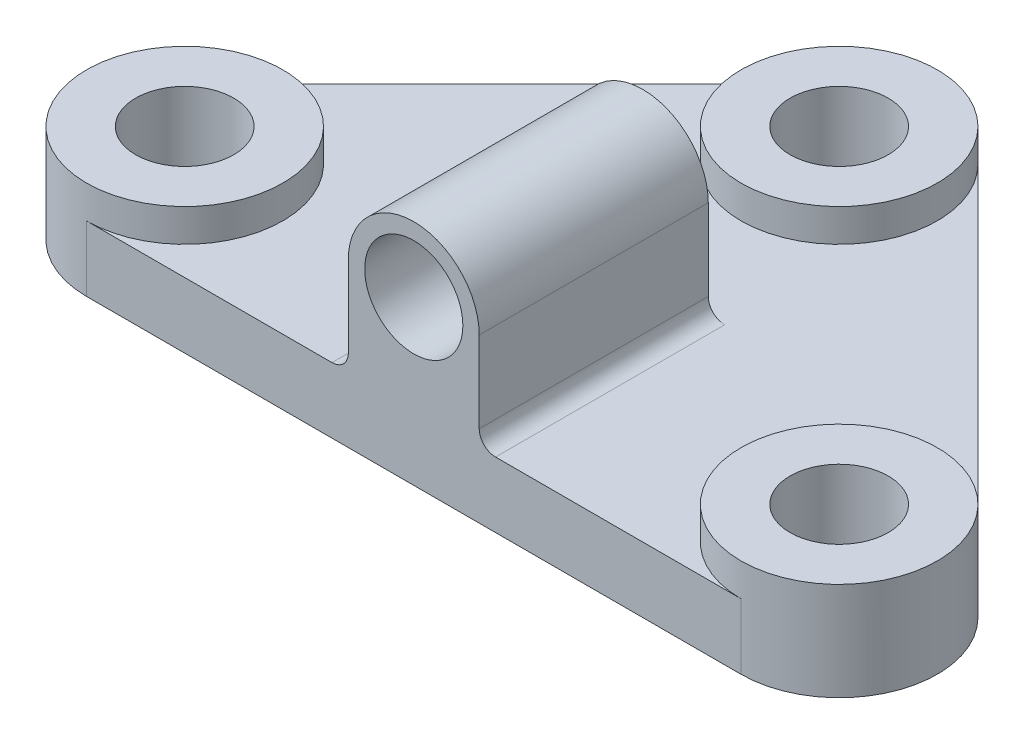
ISO-10303-21;
HEADER;
FILE_DESCRIPTION(('STEP AP214'),'2;1');
FILE_NAME('part.step','',(''),(''),'','','');
FILE_SCHEMA(('AUTOMOTIVE_DESIGN { 1 0 10303 214 1 1 1 1 }'));
ENDSEC;
DATA;
#1=APPLICATION_CONTEXT('core data for automotive mechanical design processes');
#2=APPLICATION_PROTOCOL_DEFINITION('international standard','automotive_design',2000,#1);
#3=PRODUCT_CONTEXT('',#1,'mechanical');
#4=PRODUCT('Part','Part','',(#3));
#5=PRODUCT_RELATED_PRODUCT_CATEGORY('part','',(#4));
#6=PRODUCT_DEFINITION_FORMATION('','',#4);
#7=PRODUCT_DEFINITION_CONTEXT('part definition',#1,'design');
#8=PRODUCT_DEFINITION('design','',#6,#7);
#9=PRODUCT_DEFINITION_SHAPE('','',#8);
#10=(LENGTH_UNIT() NAMED_UNIT(*) SI_UNIT(.MILLI.,.METRE.));
#11=(NAMED_UNIT(*) PLANE_ANGLE_UNIT() SI_UNIT($,.RADIAN.));
#12=(NAMED_UNIT(*) SI_UNIT($,.STERADIAN.) SOLID_ANGLE_UNIT());
#13=UNCERTAINTY_MEASURE_WITH_UNIT(LENGTH_MEASURE(1.E-05),#10,'distance_accuracy_value','');
#14=(GEOMETRIC_REPRESENTATION_CONTEXT(3) GLOBAL_UNCERTAINTY_ASSIGNED_CONTEXT((#13)) GLOBAL_UNIT_ASSIGNED_CONTEXT((#10,
#11,#12)) REPRESENTATION_CONTEXT('',''));
#15=CARTESIAN_POINT('',(0.,0.,0.));
#16=DIRECTION('',(0.,0.,1.));
#17=DIRECTION('',(1.,0.,0.));
#18=AXIS2_PLACEMENT_3D('',#15,#16,#17);
#19=CARTESIAN_POINT('',(100.,49.8,-40.));
#20=DIRECTION('',(0.,0.,-1.));
#21=DIRECTION('',(-1.,0.,0.));
#22=AXIS2_PLACEMENT_3D('',#19,#20,#21);
#23=CYLINDRICAL_SURFACE('',#22,20.);
#24=DIRECTION('',(0.,0.,1.));
#25=VECTOR('',#24,1.);
#26=CARTESIAN_POINT('',(120.,49.8,-40.));
#27=LINE('',#26,#25);
#28=CARTESIAN_POINT('',(120.,49.8,-40.));
#29=VERTEX_POINT('',#28);
#30=CARTESIAN_POINT('',(120.,49.8,30.));
#31=VERTEX_POINT('',#30);
#32=EDGE_CURVE('E151',#29,#31,#27,.T.);
#33=ORIENTED_EDGE('',*,*,#32,.F.);
#34=CARTESIAN_POINT('',(100.,49.8,-40.));
#35=DIRECTION('',(0.,0.,-1.));
#36=DIRECTION('',(-1.,0.,0.));
#37=AXIS2_PLACEMENT_3D('',#34,#35,#36);
#38=CIRCLE('',#37,20.);
#39=CARTESIAN_POINT('',(80.,49.8,-40.));
#40=VERTEX_POINT('',#39);
#41=EDGE_CURVE('E190',#40,#29,#38,.T.);
#42=ORIENTED_EDGE('',*,*,#41,.F.);
#43=DIRECTION('',(0.,0.,-1.));
#44=VECTOR('',#43,1.);
#45=CARTESIAN_POINT('',(80.,49.8,0.));
#46=LINE('',#45,#44);
#47=CARTESIAN_POINT('',(80.,49.8,30.));
#48=VERTEX_POINT('',#47);
#49=EDGE_CURVE('E187',#48,#40,#46,.T.);
#50=ORIENTED_EDGE('',*,*,#49,.F.);
#51=CARTESIAN_POINT('',(100.,49.8,30.));
#52=DIRECTION('',(0.,0.,-1.));
#53=DIRECTION('',(-1.,0.,0.));
#54=AXIS2_PLACEMENT_3D('',#51,#52,#53);
#55=CIRCLE('',#54,20.);
#56=EDGE_CURVE('E192',#31,#48,#55,.F.);
#57=ORIENTED_EDGE('',*,*,#56,.F.);
#58=EDGE_LOOP('',(#33,#42,#50,#57));
#59=FACE_BOUND('',#58,.T.);
#60=ADVANCED_FACE('F41',(#59),#23,.T.);
#61=CARTESIAN_POINT('',(121.213203435596,20.,-121.213203435596));
#62=DIRECTION('',(-0.707106781186548,0.,0.707106781186548));
#63=DIRECTION('',(0.707106781186548,0.,0.707106781186548));
#64=AXIS2_PLACEMENT_3D('',#61,#62,#63);
#65=PLANE('',#64);
#66=DIRECTION('',(-0.707106781186548,0.,-0.707106781186548));
#67=VECTOR('',#66,1.);
#68=CARTESIAN_POINT('',(121.213203435596,0.,-121.213203435596));
#69=LINE('',#68,#67);
#70=CARTESIAN_POINT('',(221.213203435596,0.,-21.2132034355964));
#71=VERTEX_POINT('',#70);
#72=CARTESIAN_POINT('',(121.213203435596,0.,-121.213203435596));
#73=VERTEX_POINT('',#72);
#74=EDGE_CURVE('E147',#71,#73,#69,.T.);
#75=ORIENTED_EDGE('',*,*,#74,.T.);
#76=DIRECTION('',(0.,-1.,0.));
#77=VECTOR('',#76,1.);
#78=CARTESIAN_POINT('',(121.213203435596,20.,-121.213203435596));
#79=LINE('',#78,#77);
#80=CARTESIAN_POINT('',(121.213203435596,20.,-121.213203435596));
#81=VERTEX_POINT('',#80);
#82=EDGE_CURVE('E152',#81,#73,#79,.T.);
#83=ORIENTED_EDGE('',*,*,#82,.F.);
#84=DIRECTION('',(-0.707106781186548,0.,-0.707106781186548));
#85=VECTOR('',#84,1.);
#86=CARTESIAN_POINT('',(121.213203435596,20.,-121.213203435596));
#87=LINE('',#86,#85);
#88=CARTESIAN_POINT('',(221.213203435596,20.,-21.2132034355964));
#89=VERTEX_POINT('',#88);
#90=EDGE_CURVE('E149',#89,#81,#87,.T.);
#91=ORIENTED_EDGE('',*,*,#90,.F.);
#92=DIRECTION('',(0.,-1.,0.));
#93=VECTOR('',#92,1.);
#94=CARTESIAN_POINT('',(221.213203435596,20.,-21.2132034355964));
#95=LINE('',#94,#93);
#96=EDGE_CURVE('E133',#89,#71,#95,.T.);
#97=ORIENTED_EDGE('',*,*,#96,.T.);
#98=EDGE_LOOP('',(#75,#83,#91,#97));
#99=FACE_BOUND('',#98,.T.);
#100=ADVANCED_FACE('F145',(#99),#65,.F.);
#101=CARTESIAN_POINT('',(-21.2132034355964,20.,-21.2132034355964));
#102=DIRECTION('',(-0.707106781186547,0.,-0.707106781186548));
#103=DIRECTION('',(-0.707106781186548,0.,0.707106781186547));
#104=AXIS2_PLACEMENT_3D('',#101,#102,#103);
#105=PLANE('',#104);
#106=DIRECTION('',(0.707106781186548,0.,-0.707106781186547));
#107=VECTOR('',#106,1.);
#108=CARTESIAN_POINT('',(-21.2132034355964,0.,-21.2132034355964));
#109=LINE('',#108,#107);
#110=CARTESIAN_POINT('',(-21.2132034355964,0.,-21.2132034355964));
#111=VERTEX_POINT('',#110);
#112=CARTESIAN_POINT('',(78.7867965644036,0.,-121.213203435596));
#113=VERTEX_POINT('',#112);
#114=EDGE_CURVE('E159',#111,#113,#109,.T.);
#115=ORIENTED_EDGE('',*,*,#114,.F.);
#116=DIRECTION('',(0.,-1.,0.));
#117=VECTOR('',#116,1.);
#118=CARTESIAN_POINT('',(-21.2132034355964,20.,-21.2132034355964));
#119=LINE('',#118,#117);
#120=CARTESIAN_POINT('',(-21.2132034355964,20.,-21.2132034355964));
#121=VERTEX_POINT('',#120);
#122=EDGE_CURVE('E178',#121,#111,#119,.T.);
#123=ORIENTED_EDGE('',*,*,#122,.F.);
#124=DIRECTION('',(0.707106781186548,0.,-0.707106781186547));
#125=VECTOR('',#124,1.);
#126=CARTESIAN_POINT('',(-21.2132034355964,20.,-21.2132034355964));
#127=LINE('',#126,#125);
#128=CARTESIAN_POINT('',(78.7867965644036,20.,-121.213203435596));
#129=VERTEX_POINT('',#128);
#130=EDGE_CURVE('E261',#121,#129,#127,.T.);
#131=ORIENTED_EDGE('',*,*,#130,.T.);
#132=DIRECTION('',(0.,-1.,0.));
#133=VECTOR('',#132,1.);
#134=CARTESIAN_POINT('',(78.7867965644036,20.,-121.213203435596));
#135=LINE('',#134,#133);
#136=EDGE_CURVE('E181',#129,#113,#135,.T.);
#137=ORIENTED_EDGE('',*,*,#136,.T.);
#138=EDGE_LOOP('',(#115,#123,#131,#137));
#139=FACE_BOUND('',#138,.T.);
#140=ADVANCED_FACE('F279',(#139),#105,.T.);
#141=CARTESIAN_POINT('',(0.,20.,30.));
#142=DIRECTION('',(0.,0.,-1.));
#143=DIRECTION('',(-1.,0.,0.));
#144=AXIS2_PLACEMENT_3D('',#141,#142,#143);
#145=PLANE('',#144);
#146=CARTESIAN_POINT('',(100.,49.8,30.));
#147=DIRECTION('',(0.,0.,1.));
#148=DIRECTION('',(1.,0.,0.));
#149=AXIS2_PLACEMENT_3D('',#146,#147,#148);
#150=CIRCLE('',#149,15.);
#151=CARTESIAN_POINT('',(115.,49.8,30.));
#152=VERTEX_POINT('',#151);
#153=EDGE_CURVE('E553',#152,#152,#150,.T.);
#154=ORIENTED_EDGE('',*,*,#153,.F.);
#155=EDGE_LOOP('',(#154));
#156=FACE_BOUND('',#155,.T.);
#157=DIRECTION('',(0.,-1.,0.));
#158=VECTOR('',#157,1.);
#159=CARTESIAN_POINT('',(120.,69.8,30.));
#160=LINE('',#159,#158);
#161=CARTESIAN_POINT('',(120.,25.,30.));
#162=VERTEX_POINT('',#161);
#163=EDGE_CURVE('E213',#31,#162,#160,.T.);
#164=ORIENTED_EDGE('',*,*,#163,.F.);
#165=ORIENTED_EDGE('',*,*,#56,.T.);
#166=DIRECTION('',(0.,-1.,0.));
#167=VECTOR('',#166,1.);
#168=CARTESIAN_POINT('',(80.,69.8,30.));
#169=LINE('',#168,#167);
#170=CARTESIAN_POINT('',(80.,25.,30.));
#171=VERTEX_POINT('',#170);
#172=EDGE_CURVE('E228',#48,#171,#169,.T.);
#173=ORIENTED_EDGE('',*,*,#172,.T.);
#174=CARTESIAN_POINT('',(75.,25.,30.));
#175=DIRECTION('',(0.,0.,-1.));
#176=DIRECTION('',(-1.,0.,0.));
#177=AXIS2_PLACEMENT_3D('',#174,#175,#176);
#178=CIRCLE('',#177,5.);
#179=CARTESIAN_POINT('',(75.,20.,30.));
#180=VERTEX_POINT('',#179);
#181=EDGE_CURVE('E11',#171,#180,#178,.T.);
#182=ORIENTED_EDGE('',*,*,#181,.T.);
#183=DIRECTION('',(1.,0.,0.));
#184=VECTOR('',#183,1.);
#185=CARTESIAN_POINT('',(0.,20.,30.));
#186=LINE('',#185,#184);
#187=CARTESIAN_POINT('',(0.,20.,30.));
#188=VERTEX_POINT('',#187);
#189=EDGE_CURVE('E265',#188,#180,#186,.T.);
#190=ORIENTED_EDGE('',*,*,#189,.F.);
#191=DIRECTION('',(0.,-1.,0.));
#192=VECTOR('',#191,1.);
#193=CARTESIAN_POINT('',(0.,20.,30.));
#194=LINE('',#193,#192);
#195=CARTESIAN_POINT('',(0.,0.,30.));
#196=VERTEX_POINT('',#195);
#197=EDGE_CURVE('E174',#188,#196,#194,.T.);
#198=ORIENTED_EDGE('',*,*,#197,.T.);
#199=DIRECTION('',(1.,0.,0.));
#200=VECTOR('',#199,1.);
#201=CARTESIAN_POINT('',(0.,0.,30.));
#202=LINE('',#201,#200);
#203=CARTESIAN_POINT('',(200.,0.,30.));
#204=VERTEX_POINT('',#203);
#205=EDGE_CURVE('E162',#196,#204,#202,.T.);
#206=ORIENTED_EDGE('',*,*,#205,.T.);
#207=DIRECTION('',(0.,-1.,0.));
#208=VECTOR('',#207,1.);
#209=CARTESIAN_POINT('',(200.,20.,30.));
#210=LINE('',#209,#208);
#211=CARTESIAN_POINT('',(200.,20.,30.));
#212=VERTEX_POINT('',#211);
#213=EDGE_CURVE('E136',#212,#204,#210,.T.);
#214=ORIENTED_EDGE('',*,*,#213,.F.);
#215=CARTESIAN_POINT('',(125.,20.,30.));
#216=VERTEX_POINT('',#215);
#217=EDGE_CURVE('E175',#216,#212,#186,.T.);
#218=ORIENTED_EDGE('',*,*,#217,.F.);
#219=CARTESIAN_POINT('',(125.,25.,30.));
#220=DIRECTION('',(0.,0.,-1.));
#221=DIRECTION('',(-1.,0.,0.));
#222=AXIS2_PLACEMENT_3D('',#219,#220,#221);
#223=CIRCLE('',#222,5.);
#224=EDGE_CURVE('E206',#216,#162,#223,.T.);
#225=ORIENTED_EDGE('',*,*,#224,.T.);
#226=EDGE_LOOP('',(#164,#165,#173,#182,#190,#198,#206,#214,#218,#225));
#227=FACE_BOUND('',#226,.T.);
#228=ADVANCED_FACE('F212',(#156,#227),#145,.F.);
#229=CARTESIAN_POINT('',(0.,20.,0.));
#230=DIRECTION('',(0.,1.,0.));
#231=DIRECTION('',(0.,0.,1.));
#232=AXIS2_PLACEMENT_3D('',#229,#230,#231);
#233=PLANE('',#232);
#234=DIRECTION('',(1.,0.,0.));
#235=VECTOR('',#234,1.);
#236=CARTESIAN_POINT('',(0.,20.,-40.));
#237=LINE('',#236,#235);
#238=CARTESIAN_POINT('',(75.,20.,-40.));
#239=VERTEX_POINT('',#238);
#240=CARTESIAN_POINT('',(125.,20.,-40.));
#241=VERTEX_POINT('',#240);
#242=EDGE_CURVE('E168',#239,#241,#237,.T.);
#243=ORIENTED_EDGE('',*,*,#242,.T.);
#244=DIRECTION('',(0.,0.,-1.));
#245=VECTOR('',#244,1.);
#246=CARTESIAN_POINT('',(125.,20.,0.));
#247=LINE('',#246,#245);
#248=EDGE_CURVE('E200',#241,#216,#247,.F.);
#249=ORIENTED_EDGE('',*,*,#248,.T.);
#250=ORIENTED_EDGE('',*,*,#217,.T.);
#251=CARTESIAN_POINT('',(200.,20.,0.));
#252=DIRECTION('',(0.,1.,0.));
#253=DIRECTION('',(0.,0.,1.));
#254=AXIS2_PLACEMENT_3D('',#251,#252,#253);
#255=CIRCLE('',#254,30.);
#256=EDGE_CURVE('E172',#89,#212,#255,.T.);
#257=ORIENTED_EDGE('',*,*,#256,.F.);
#258=ORIENTED_EDGE('',*,*,#90,.T.);
#259=CARTESIAN_POINT('',(100.,20.,-100.));
#260=DIRECTION('',(0.,1.,0.));
#261=DIRECTION('',(0.,0.,1.));
#262=AXIS2_PLACEMENT_3D('',#259,#260,#261);
#263=CIRCLE('',#262,30.);
#264=EDGE_CURVE('E259',#129,#81,#263,.T.);
#265=ORIENTED_EDGE('',*,*,#264,.F.);
#266=ORIENTED_EDGE('',*,*,#130,.F.);
#267=CARTESIAN_POINT('',(0.,20.,0.));
#268=DIRECTION('',(0.,1.,0.));
#269=DIRECTION('',(0.,0.,1.));
#270=AXIS2_PLACEMENT_3D('',#267,#268,#269);
#271=CIRCLE('',#270,30.);
#272=EDGE_CURVE('E264',#188,#121,#271,.T.);
#273=ORIENTED_EDGE('',*,*,#272,.F.);
#274=ORIENTED_EDGE('',*,*,#189,.T.);
#275=DIRECTION('',(0.,0.,-1.));
#276=VECTOR('',#275,1.);
#277=CARTESIAN_POINT('',(75.,20.,-40.));
#278=LINE('',#277,#276);
#279=EDGE_CURVE('E197',#180,#239,#278,.T.);
#280=ORIENTED_EDGE('',*,*,#279,.T.);
#281=EDGE_LOOP('',(#243,#249,#250,#257,#258,#265,#266,#273,#274,#280));
#282=FACE_BOUND('',#281,.T.);
#283=ADVANCED_FACE('F271',(#282),#233,.T.);
#284=CARTESIAN_POINT('',(0.,0.,0.));
#285=DIRECTION('',(0.,1.,0.));
#286=DIRECTION('',(0.,0.,1.));
#287=AXIS2_PLACEMENT_3D('',#284,#285,#286);
#288=PLANE('',#287);
#289=ORIENTED_EDGE('',*,*,#205,.F.);
#290=CARTESIAN_POINT('',(0.,0.,0.));
#291=DIRECTION('',(0.,1.,0.));
#292=DIRECTION('',(0.,0.,1.));
#293=AXIS2_PLACEMENT_3D('',#290,#291,#292);
#294=CIRCLE('',#293,30.);
#295=EDGE_CURVE('E251',#111,#196,#294,.T.);
#296=ORIENTED_EDGE('',*,*,#295,.F.);
#297=ORIENTED_EDGE('',*,*,#114,.T.);
#298=CARTESIAN_POINT('',(100.,0.,-100.));
#299=DIRECTION('',(0.,1.,0.));
#300=DIRECTION('',(0.,0.,1.));
#301=AXIS2_PLACEMENT_3D('',#298,#299,#300);
#302=CIRCLE('',#301,30.);
#303=EDGE_CURVE('E157',#73,#113,#302,.T.);
#304=ORIENTED_EDGE('',*,*,#303,.F.);
#305=ORIENTED_EDGE('',*,*,#74,.F.);
#306=CARTESIAN_POINT('',(200.,0.,0.));
#307=DIRECTION('',(0.,1.,0.));
#308=DIRECTION('',(0.,0.,1.));
#309=AXIS2_PLACEMENT_3D('',#306,#307,#308);
#310=CIRCLE('',#309,30.);
#311=EDGE_CURVE('E129',#204,#71,#310,.T.);
#312=ORIENTED_EDGE('',*,*,#311,.F.);
#313=EDGE_LOOP('',(#289,#296,#297,#304,#305,#312));
#314=FACE_BOUND('',#313,.T.);
#315=CARTESIAN_POINT('',(0.,0.,0.));
#316=DIRECTION('',(0.,1.,0.));
#317=DIRECTION('',(0.,0.,1.));
#318=AXIS2_PLACEMENT_3D('',#315,#316,#317);
#319=CIRCLE('',#318,15.);
#320=CARTESIAN_POINT('',(0.,0.,15.));
#321=VERTEX_POINT('',#320);
#322=EDGE_CURVE('E246',#321,#321,#319,.T.);
#323=ORIENTED_EDGE('',*,*,#322,.T.);
#324=EDGE_LOOP('',(#323));
#325=FACE_BOUND('',#324,.T.);
#326=CARTESIAN_POINT('',(100.,0.,-100.));
#327=DIRECTION('',(0.,1.,0.));
#328=DIRECTION('',(0.,0.,1.));
#329=AXIS2_PLACEMENT_3D('',#326,#327,#328);
#330=CIRCLE('',#329,15.);
#331=CARTESIAN_POINT('',(100.,0.,-85.));
#332=VERTEX_POINT('',#331);
#333=EDGE_CURVE('E237',#332,#332,#330,.T.);
#334=ORIENTED_EDGE('',*,*,#333,.T.);
#335=EDGE_LOOP('',(#334));
#336=FACE_BOUND('',#335,.T.);
#337=CARTESIAN_POINT('',(200.,0.,0.));
#338=DIRECTION('',(0.,1.,0.));
#339=DIRECTION('',(0.,0.,1.));
#340=AXIS2_PLACEMENT_3D('',#337,#338,#339);
#341=CIRCLE('',#340,15.);
#342=CARTESIAN_POINT('',(200.,0.,15.));
#343=VERTEX_POINT('',#342);
#344=EDGE_CURVE('E141',#343,#343,#341,.T.);
#345=ORIENTED_EDGE('',*,*,#344,.T.);
#346=EDGE_LOOP('',(#345));
#347=FACE_BOUND('',#346,.T.);
#348=ADVANCED_FACE('F154',(#314,#325,#336,#347),#288,.F.);
#349=CARTESIAN_POINT('',(0.,30.,0.));
#350=DIRECTION('',(0.,-1.,0.));
#351=DIRECTION('',(0.,0.,-1.));
#352=AXIS2_PLACEMENT_3D('',#349,#350,#351);
#353=CYLINDRICAL_SURFACE('',#352,15.);
#354=CARTESIAN_POINT('',(0.,30.,0.));
#355=DIRECTION('',(0.,1.,0.));
#356=DIRECTION('',(0.,0.,1.));
#357=AXIS2_PLACEMENT_3D('',#354,#355,#356);
#358=CIRCLE('',#357,15.);
#359=CARTESIAN_POINT('',(0.,30.,15.));
#360=VERTEX_POINT('',#359);
#361=EDGE_CURVE('E165',#360,#360,#358,.T.);
#362=ORIENTED_EDGE('',*,*,#361,.T.);
#363=EDGE_LOOP('',(#362));
#364=FACE_BOUND('',#363,.T.);
#365=ORIENTED_EDGE('',*,*,#322,.F.);
#366=EDGE_LOOP('',(#365));
#367=FACE_BOUND('',#366,.T.);
#368=ADVANCED_FACE('F342',(#364,#367),#353,.F.);
#369=CARTESIAN_POINT('',(0.,30.,0.));
#370=DIRECTION('',(0.,-1.,0.));
#371=DIRECTION('',(0.,0.,-1.));
#372=AXIS2_PLACEMENT_3D('',#369,#370,#371);
#373=CYLINDRICAL_SURFACE('',#372,30.);
#374=ORIENTED_EDGE('',*,*,#122,.T.);
#375=ORIENTED_EDGE('',*,*,#295,.T.);
#376=ORIENTED_EDGE('',*,*,#197,.F.);
#377=ORIENTED_EDGE('',*,*,#272,.T.);
#378=EDGE_LOOP('',(#374,#375,#376,#377));
#379=FACE_BOUND('',#378,.T.);
#380=CARTESIAN_POINT('',(0.,30.,0.));
#381=DIRECTION('',(0.,1.,0.));
#382=DIRECTION('',(0.,0.,1.));
#383=AXIS2_PLACEMENT_3D('',#380,#381,#382);
#384=CIRCLE('',#383,30.);
#385=CARTESIAN_POINT('',(0.,30.,30.));
#386=VERTEX_POINT('',#385);
#387=EDGE_CURVE('E160',#386,#386,#384,.T.);
#388=ORIENTED_EDGE('',*,*,#387,.F.);
#389=EDGE_LOOP('',(#388));
#390=FACE_BOUND('',#389,.T.);
#391=ADVANCED_FACE('F273',(#379,#390),#373,.T.);
#392=CARTESIAN_POINT('',(0.,30.,0.));
#393=DIRECTION('',(0.,1.,0.));
#394=DIRECTION('',(0.,0.,1.));
#395=AXIS2_PLACEMENT_3D('',#392,#393,#394);
#396=PLANE('',#395);
#397=ORIENTED_EDGE('',*,*,#361,.F.);
#398=EDGE_LOOP('',(#397));
#399=FACE_BOUND('',#398,.T.);
#400=ORIENTED_EDGE('',*,*,#387,.T.);
#401=EDGE_LOOP('',(#400));
#402=FACE_BOUND('',#401,.T.);
#403=ADVANCED_FACE('F458',(#399,#402),#396,.T.);
#404=CARTESIAN_POINT('',(100.,30.,-100.));
#405=DIRECTION('',(0.,-1.,0.));
#406=DIRECTION('',(0.,0.,-1.));
#407=AXIS2_PLACEMENT_3D('',#404,#405,#406);
#408=CYLINDRICAL_SURFACE('',#407,15.);
#409=CARTESIAN_POINT('',(100.,30.,-100.));
#410=DIRECTION('',(0.,1.,0.));
#411=DIRECTION('',(0.,0.,1.));
#412=AXIS2_PLACEMENT_3D('',#409,#410,#411);
#413=CIRCLE('',#412,15.);
#414=CARTESIAN_POINT('',(100.,30.,-85.));
#415=VERTEX_POINT('',#414);
#416=EDGE_CURVE('E240',#415,#415,#413,.T.);
#417=ORIENTED_EDGE('',*,*,#416,.T.);
#418=EDGE_LOOP('',(#417));
#419=FACE_BOUND('',#418,.T.);
#420=ORIENTED_EDGE('',*,*,#333,.F.);
#421=EDGE_LOOP('',(#420));
#422=FACE_BOUND('',#421,.T.);
#423=ADVANCED_FACE('F286',(#419,#422),#408,.F.);
#424=CARTESIAN_POINT('',(100.,30.,-100.));
#425=DIRECTION('',(0.,-1.,0.));
#426=DIRECTION('',(0.,0.,-1.));
#427=AXIS2_PLACEMENT_3D('',#424,#425,#426);
#428=CYLINDRICAL_SURFACE('',#427,30.);
#429=ORIENTED_EDGE('',*,*,#82,.T.);
#430=ORIENTED_EDGE('',*,*,#303,.T.);
#431=ORIENTED_EDGE('',*,*,#136,.F.);
#432=ORIENTED_EDGE('',*,*,#264,.T.);
#433=EDGE_LOOP('',(#429,#430,#431,#432));
#434=FACE_BOUND('',#433,.T.);
#435=CARTESIAN_POINT('',(100.,30.,-100.));
#436=DIRECTION('',(0.,1.,0.));
#437=DIRECTION('',(0.,0.,1.));
#438=AXIS2_PLACEMENT_3D('',#435,#436,#437);
#439=CIRCLE('',#438,30.);
#440=CARTESIAN_POINT('',(100.,30.,-70.));
#441=VERTEX_POINT('',#440);
#442=EDGE_CURVE('E243',#441,#441,#439,.T.);
#443=ORIENTED_EDGE('',*,*,#442,.F.);
#444=EDGE_LOOP('',(#443));
#445=FACE_BOUND('',#444,.T.);
#446=ADVANCED_FACE('F282',(#434,#445),#428,.T.);
#447=CARTESIAN_POINT('',(0.,30.,0.));
#448=DIRECTION('',(0.,1.,0.));
#449=DIRECTION('',(0.,0.,1.));
#450=AXIS2_PLACEMENT_3D('',#447,#448,#449);
#451=PLANE('',#450);
#452=ORIENTED_EDGE('',*,*,#416,.F.);
#453=EDGE_LOOP('',(#452));
#454=FACE_BOUND('',#453,.T.);
#455=ORIENTED_EDGE('',*,*,#442,.T.);
#456=EDGE_LOOP('',(#455));
#457=FACE_BOUND('',#456,.T.);
#458=ADVANCED_FACE('F285',(#454,#457),#451,.T.);
#459=CARTESIAN_POINT('',(200.,30.,0.));
#460=DIRECTION('',(0.,-1.,0.));
#461=DIRECTION('',(0.,0.,-1.));
#462=AXIS2_PLACEMENT_3D('',#459,#460,#461);
#463=CYLINDRICAL_SURFACE('',#462,30.);
#464=CARTESIAN_POINT('',(200.,30.,0.));
#465=DIRECTION('',(0.,1.,0.));
#466=DIRECTION('',(0.,0.,1.));
#467=AXIS2_PLACEMENT_3D('',#464,#465,#466);
#468=CIRCLE('',#467,30.);
#469=CARTESIAN_POINT('',(200.,30.,30.));
#470=VERTEX_POINT('',#469);
#471=EDGE_CURVE('E234',#470,#470,#468,.T.);
#472=ORIENTED_EDGE('',*,*,#471,.F.);
#473=EDGE_LOOP('',(#472));
#474=FACE_BOUND('',#473,.T.);
#475=ORIENTED_EDGE('',*,*,#311,.T.);
#476=ORIENTED_EDGE('',*,*,#96,.F.);
#477=ORIENTED_EDGE('',*,*,#256,.T.);
#478=ORIENTED_EDGE('',*,*,#213,.T.);
#479=EDGE_LOOP('',(#475,#476,#477,#478));
#480=FACE_BOUND('',#479,.T.);
#481=ADVANCED_FACE('F131',(#474,#480),#463,.T.);
#482=CARTESIAN_POINT('',(200.,30.,0.));
#483=DIRECTION('',(0.,-1.,0.));
#484=DIRECTION('',(0.,0.,-1.));
#485=AXIS2_PLACEMENT_3D('',#482,#483,#484);
#486=CYLINDRICAL_SURFACE('',#485,15.);
#487=CARTESIAN_POINT('',(200.,30.,0.));
#488=DIRECTION('',(0.,1.,0.));
#489=DIRECTION('',(0.,0.,1.));
#490=AXIS2_PLACEMENT_3D('',#487,#488,#489);
#491=CIRCLE('',#490,15.);
#492=CARTESIAN_POINT('',(200.,30.,15.));
#493=VERTEX_POINT('',#492);
#494=EDGE_CURVE('E140',#493,#493,#491,.T.);
#495=ORIENTED_EDGE('',*,*,#494,.T.);
#496=EDGE_LOOP('',(#495));
#497=FACE_BOUND('',#496,.T.);
#498=ORIENTED_EDGE('',*,*,#344,.F.);
#499=EDGE_LOOP('',(#498));
#500=FACE_BOUND('',#499,.T.);
#501=ADVANCED_FACE('F296',(#497,#500),#486,.F.);
#502=CARTESIAN_POINT('',(0.,30.,0.));
#503=DIRECTION('',(0.,1.,0.));
#504=DIRECTION('',(0.,0.,1.));
#505=AXIS2_PLACEMENT_3D('',#502,#503,#504);
#506=PLANE('',#505);
#507=ORIENTED_EDGE('',*,*,#494,.F.);
#508=EDGE_LOOP('',(#507));
#509=FACE_BOUND('',#508,.T.);
#510=ORIENTED_EDGE('',*,*,#471,.T.);
#511=EDGE_LOOP('',(#510));
#512=FACE_BOUND('',#511,.T.);
#513=ADVANCED_FACE('F330',(#509,#512),#506,.T.);
#514=CARTESIAN_POINT('',(120.,69.8,0.));
#515=DIRECTION('',(-1.,0.,0.));
#516=DIRECTION('',(0.,0.,1.));
#517=AXIS2_PLACEMENT_3D('',#514,#515,#516);
#518=PLANE('',#517);
#519=ORIENTED_EDGE('',*,*,#163,.T.);
#520=DIRECTION('',(0.,0.,-1.));
#521=VECTOR('',#520,1.);
#522=CARTESIAN_POINT('',(120.,25.,0.));
#523=LINE('',#522,#521);
#524=CARTESIAN_POINT('',(120.,25.,-40.));
#525=VERTEX_POINT('',#524);
#526=EDGE_CURVE('E194',#162,#525,#523,.T.);
#527=ORIENTED_EDGE('',*,*,#526,.T.);
#528=DIRECTION('',(0.,-1.,0.));
#529=VECTOR('',#528,1.);
#530=CARTESIAN_POINT('',(120.,69.8,-40.));
#531=LINE('',#530,#529);
#532=EDGE_CURVE('E222',#29,#525,#531,.T.);
#533=ORIENTED_EDGE('',*,*,#532,.F.);
#534=ORIENTED_EDGE('',*,*,#32,.T.);
#535=EDGE_LOOP('',(#519,#527,#533,#534));
#536=FACE_BOUND('',#535,.T.);
#537=ADVANCED_FACE('F218',(#536),#518,.F.);
#538=CARTESIAN_POINT('',(0.,69.8,-40.));
#539=DIRECTION('',(0.,0.,-1.));
#540=DIRECTION('',(-1.,0.,0.));
#541=AXIS2_PLACEMENT_3D('',#538,#539,#540);
#542=PLANE('',#541);
#543=CARTESIAN_POINT('',(100.,49.8,-40.));
#544=DIRECTION('',(0.,0.,-1.));
#545=DIRECTION('',(-1.,0.,0.));
#546=AXIS2_PLACEMENT_3D('',#543,#544,#545);
#547=CIRCLE('',#546,15.);
#548=CARTESIAN_POINT('',(85.,49.8,-40.));
#549=VERTEX_POINT('',#548);
#550=EDGE_CURVE('E550',#549,#549,#547,.F.);
#551=ORIENTED_EDGE('',*,*,#550,.T.);
#552=EDGE_LOOP('',(#551));
#553=FACE_BOUND('',#552,.T.);
#554=DIRECTION('',(0.,-1.,0.));
#555=VECTOR('',#554,1.);
#556=CARTESIAN_POINT('',(80.,69.8,-40.));
#557=LINE('',#556,#555);
#558=CARTESIAN_POINT('',(80.,25.,-40.));
#559=VERTEX_POINT('',#558);
#560=EDGE_CURVE('E226',#40,#559,#557,.T.);
#561=ORIENTED_EDGE('',*,*,#560,.F.);
#562=ORIENTED_EDGE('',*,*,#41,.T.);
#563=ORIENTED_EDGE('',*,*,#532,.T.);
#564=CARTESIAN_POINT('',(125.,25.,-40.));
#565=DIRECTION('',(0.,0.,-1.));
#566=DIRECTION('',(-1.,0.,0.));
#567=AXIS2_PLACEMENT_3D('',#564,#565,#566);
#568=CIRCLE('',#567,5.);
#569=EDGE_CURVE('E203',#525,#241,#568,.F.);
#570=ORIENTED_EDGE('',*,*,#569,.T.);
#571=ORIENTED_EDGE('',*,*,#242,.F.);
#572=CARTESIAN_POINT('',(75.,25.,-40.));
#573=DIRECTION('',(0.,0.,-1.));
#574=DIRECTION('',(-1.,0.,0.));
#575=AXIS2_PLACEMENT_3D('',#572,#573,#574);
#576=CIRCLE('',#575,5.);
#577=EDGE_CURVE('E49',#239,#559,#576,.F.);
#578=ORIENTED_EDGE('',*,*,#577,.T.);
#579=EDGE_LOOP('',(#561,#562,#563,#570,#571,#578));
#580=FACE_BOUND('',#579,.T.);
#581=ADVANCED_FACE('F225',(#553,#580),#542,.T.);
#582=CARTESIAN_POINT('',(80.,69.8,0.));
#583=DIRECTION('',(-1.,0.,0.));
#584=DIRECTION('',(0.,0.,1.));
#585=AXIS2_PLACEMENT_3D('',#582,#583,#584);
#586=PLANE('',#585);
#587=ORIENTED_EDGE('',*,*,#560,.T.);
#588=DIRECTION('',(0.,0.,-1.));
#589=VECTOR('',#588,1.);
#590=CARTESIAN_POINT('',(80.,25.,30.));
#591=LINE('',#590,#589);
#592=EDGE_CURVE('E62',#559,#171,#591,.F.);
#593=ORIENTED_EDGE('',*,*,#592,.T.);
#594=ORIENTED_EDGE('',*,*,#172,.F.);
#595=ORIENTED_EDGE('',*,*,#49,.T.);
#596=EDGE_LOOP('',(#587,#593,#594,#595));
#597=FACE_BOUND('',#596,.T.);
#598=ADVANCED_FACE('F313',(#597),#586,.T.);
#599=CARTESIAN_POINT('',(125.,25.,0.));
#600=DIRECTION('',(0.,0.,-1.));
#601=DIRECTION('',(-1.,0.,0.));
#602=AXIS2_PLACEMENT_3D('',#599,#600,#601);
#603=CYLINDRICAL_SURFACE('',#602,5.);
#604=ORIENTED_EDGE('',*,*,#224,.F.);
#605=ORIENTED_EDGE('',*,*,#248,.F.);
#606=ORIENTED_EDGE('',*,*,#569,.F.);
#607=ORIENTED_EDGE('',*,*,#526,.F.);
#608=EDGE_LOOP('',(#604,#605,#606,#607));
#609=FACE_BOUND('',#608,.T.);
#610=ADVANCED_FACE('F224',(#609),#603,.F.);
#611=CARTESIAN_POINT('',(75.,25.,0.));
#612=DIRECTION('',(0.,0.,1.));
#613=DIRECTION('',(1.,0.,0.));
#614=AXIS2_PLACEMENT_3D('',#611,#612,#613);
#615=CYLINDRICAL_SURFACE('',#614,5.);
#616=ORIENTED_EDGE('',*,*,#181,.F.);
#617=ORIENTED_EDGE('',*,*,#592,.F.);
#618=ORIENTED_EDGE('',*,*,#577,.F.);
#619=ORIENTED_EDGE('',*,*,#279,.F.);
#620=EDGE_LOOP('',(#616,#617,#618,#619));
#621=FACE_BOUND('',#620,.T.);
#622=ADVANCED_FACE('F43',(#621),#615,.F.);
#623=CARTESIAN_POINT('',(100.,49.8,-130.001));
#624=DIRECTION('',(0.,0.,1.));
#625=DIRECTION('',(1.,0.,0.));
#626=AXIS2_PLACEMENT_3D('',#623,#624,#625);
#627=CYLINDRICAL_SURFACE('',#626,15.);
#628=ORIENTED_EDGE('',*,*,#550,.F.);
#629=EDGE_LOOP('',(#628));
#630=FACE_BOUND('',#629,.T.);
#631=ORIENTED_EDGE('',*,*,#153,.T.);
#632=EDGE_LOOP('',(#631));
#633=FACE_BOUND('',#632,.T.);
#634=ADVANCED_FACE('F318',(#630,#633),#627,.F.);
#635=CLOSED_SHELL('',(#60,#100,#140,#228,#283,#348,#368,#391,#403,#423,#446,#458,#481,#501,#513,
#537,#581,#598,#610,#622,#634));
#636=MANIFOLD_SOLID_BREP('B2',#635);
#637=ADVANCED_BREP_SHAPE_REPRESENTATION('',(#18,#636),#14);
#638=SHAPE_DEFINITION_REPRESENTATION(#9,#637);
ENDSEC;
END-ISO-10303-21;
